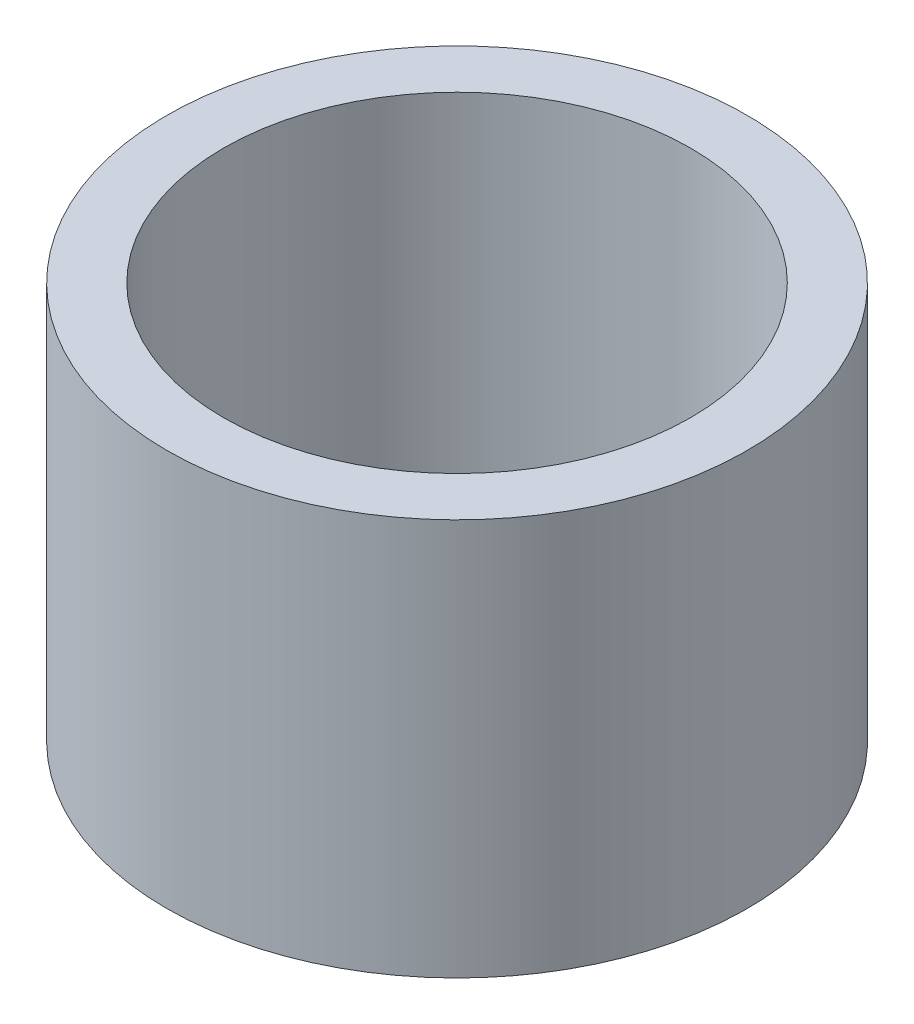
ISO-10303-21;
HEADER;
FILE_DESCRIPTION(('STEP AP214'),'2;1');
FILE_NAME('part.step','',(''),(''),'','','');
FILE_SCHEMA(('AUTOMOTIVE_DESIGN { 1 0 10303 214 1 1 1 1 }'));
ENDSEC;
DATA;
#1=APPLICATION_CONTEXT('core data for automotive mechanical design processes');
#2=APPLICATION_PROTOCOL_DEFINITION('international standard','automotive_design',2000,#1);
#3=PRODUCT_CONTEXT('',#1,'mechanical');
#4=PRODUCT('Part','Part','',(#3));
#5=PRODUCT_RELATED_PRODUCT_CATEGORY('part','',(#4));
#6=PRODUCT_DEFINITION_FORMATION('','',#4);
#7=PRODUCT_DEFINITION_CONTEXT('part definition',#1,'design');
#8=PRODUCT_DEFINITION('design','',#6,#7);
#9=PRODUCT_DEFINITION_SHAPE('','',#8);
#10=(LENGTH_UNIT() NAMED_UNIT(*) SI_UNIT(.MILLI.,.METRE.));
#11=(NAMED_UNIT(*) PLANE_ANGLE_UNIT() SI_UNIT($,.RADIAN.));
#12=(NAMED_UNIT(*) SI_UNIT($,.STERADIAN.) SOLID_ANGLE_UNIT());
#13=UNCERTAINTY_MEASURE_WITH_UNIT(LENGTH_MEASURE(1.E-05),#10,'distance_accuracy_value','');
#14=(GEOMETRIC_REPRESENTATION_CONTEXT(3) GLOBAL_UNCERTAINTY_ASSIGNED_CONTEXT((#13)) GLOBAL_UNIT_ASSIGNED_CONTEXT((#10,
#11,#12)) REPRESENTATION_CONTEXT('',''));
#15=CARTESIAN_POINT('',(0.,0.,0.));
#16=DIRECTION('',(0.,0.,1.));
#17=DIRECTION('',(1.,0.,0.));
#18=AXIS2_PLACEMENT_3D('',#15,#16,#17);
#19=CARTESIAN_POINT('',(11.592950035487,44.45,-49.39210020666));
#20=DIRECTION('',(0.,-1.,0.));
#21=DIRECTION('',(0.,0.,-1.));
#22=AXIS2_PLACEMENT_3D('',#19,#20,#21);
#23=CYLINDRICAL_SURFACE('',#22,32.512);
#24=CARTESIAN_POINT('',(11.592950035487,44.45,-49.39210020666));
#25=DIRECTION('',(0.,1.,0.));
#26=DIRECTION('',(0.,0.,1.));
#27=AXIS2_PLACEMENT_3D('',#24,#25,#26);
#28=CIRCLE('',#27,32.512);
#29=CARTESIAN_POINT('',(11.592950035487,44.45,-16.88010020666));
#30=VERTEX_POINT('',#29);
#31=EDGE_CURVE('E10',#30,#30,#28,.T.);
#32=ORIENTED_EDGE('',*,*,#31,.F.);
#33=EDGE_LOOP('',(#32));
#34=FACE_BOUND('',#33,.T.);
#35=CARTESIAN_POINT('',(11.592950035487,0.,-49.39210020666));
#36=DIRECTION('',(0.,1.,0.));
#37=DIRECTION('',(0.,0.,1.));
#38=AXIS2_PLACEMENT_3D('',#35,#36,#37);
#39=CIRCLE('',#38,32.512);
#40=CARTESIAN_POINT('',(11.592950035487,0.,-16.88010020666));
#41=VERTEX_POINT('',#40);
#42=EDGE_CURVE('E40',#41,#41,#39,.T.);
#43=ORIENTED_EDGE('',*,*,#42,.T.);
#44=EDGE_LOOP('',(#43));
#45=FACE_BOUND('',#44,.T.);
#46=ADVANCED_FACE('F37',(#34,#45),#23,.T.);
#47=CARTESIAN_POINT('',(11.592950035487,44.45,-49.39210020666));
#48=DIRECTION('',(0.,1.,0.));
#49=DIRECTION('',(0.,0.,1.));
#50=AXIS2_PLACEMENT_3D('',#47,#48,#49);
#51=PLANE('',#50);
#52=CARTESIAN_POINT('',(11.592950035487,44.45,-49.39210020666));
#53=DIRECTION('',(0.,1.,0.));
#54=DIRECTION('',(0.,0.,1.));
#55=AXIS2_PLACEMENT_3D('',#52,#53,#54);
#56=CIRCLE('',#55,26.162);
#57=CARTESIAN_POINT('',(11.592950035487,44.45,-23.23010020666));
#58=VERTEX_POINT('',#57);
#59=EDGE_CURVE('E51',#58,#58,#56,.T.);
#60=ORIENTED_EDGE('',*,*,#59,.F.);
#61=EDGE_LOOP('',(#60));
#62=FACE_BOUND('',#61,.T.);
#63=ORIENTED_EDGE('',*,*,#31,.T.);
#64=EDGE_LOOP('',(#63));
#65=FACE_BOUND('',#64,.T.);
#66=ADVANCED_FACE('F68',(#62,#65),#51,.T.);
#67=CARTESIAN_POINT('',(11.592950035487,0.,-49.39210020666));
#68=DIRECTION('',(0.,1.,0.));
#69=DIRECTION('',(0.,0.,1.));
#70=AXIS2_PLACEMENT_3D('',#67,#68,#69);
#71=PLANE('',#70);
#72=CARTESIAN_POINT('',(11.592950035487,0.,-49.39210020666));
#73=DIRECTION('',(0.,1.,0.));
#74=DIRECTION('',(0.,0.,1.));
#75=AXIS2_PLACEMENT_3D('',#72,#73,#74);
#76=CIRCLE('',#75,26.162);
#77=CARTESIAN_POINT('',(11.592950035487,0.,-23.23010020666));
#78=VERTEX_POINT('',#77);
#79=EDGE_CURVE('E49',#78,#78,#76,.T.);
#80=ORIENTED_EDGE('',*,*,#79,.T.);
#81=EDGE_LOOP('',(#80));
#82=FACE_BOUND('',#81,.T.);
#83=ORIENTED_EDGE('',*,*,#42,.F.);
#84=EDGE_LOOP('',(#83));
#85=FACE_BOUND('',#84,.T.);
#86=ADVANCED_FACE('F59',(#82,#85),#71,.F.);
#87=CARTESIAN_POINT('',(11.592950035487,0.,-49.39210020666));
#88=DIRECTION('',(0.,1.,0.));
#89=DIRECTION('',(0.,0.,1.));
#90=AXIS2_PLACEMENT_3D('',#87,#88,#89);
#91=CYLINDRICAL_SURFACE('',#90,26.162);
#92=ORIENTED_EDGE('',*,*,#79,.F.);
#93=EDGE_LOOP('',(#92));
#94=FACE_BOUND('',#93,.T.);
#95=ORIENTED_EDGE('',*,*,#59,.T.);
#96=EDGE_LOOP('',(#95));
#97=FACE_BOUND('',#96,.T.);
#98=ADVANCED_FACE('F62',(#94,#97),#91,.F.);
#99=CLOSED_SHELL('',(#46,#66,#86,#98));
#100=MANIFOLD_SOLID_BREP('B2',#99);
#101=ADVANCED_BREP_SHAPE_REPRESENTATION('',(#18,#100),#14);
#102=SHAPE_DEFINITION_REPRESENTATION(#9,#101);
ENDSEC;
END-ISO-10303-21;
